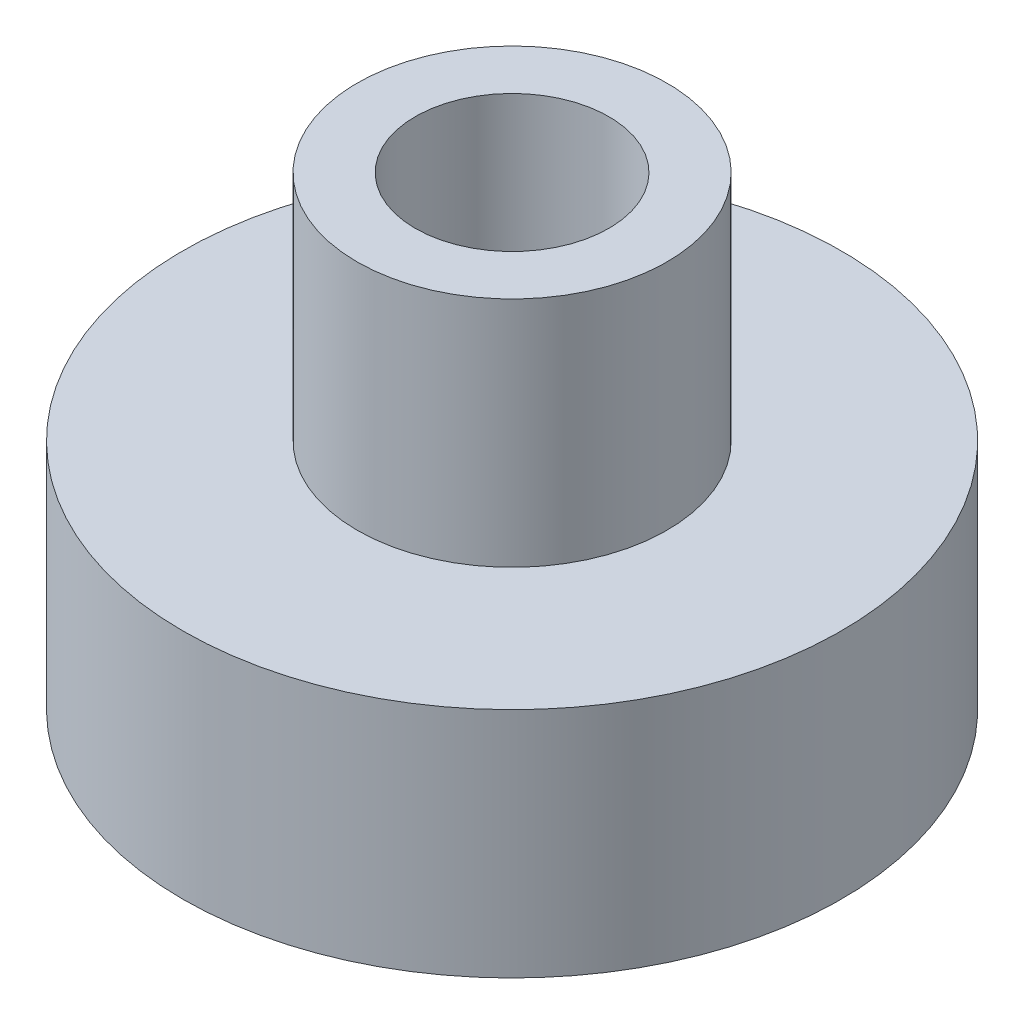
ISO-10303-21;
HEADER;
FILE_DESCRIPTION(('STEP AP214'),'2;1');
FILE_NAME('part.step','',(''),(''),'','','');
FILE_SCHEMA(('AUTOMOTIVE_DESIGN { 1 0 10303 214 1 1 1 1 }'));
ENDSEC;
DATA;
#1=APPLICATION_CONTEXT('core data for automotive mechanical design processes');
#2=APPLICATION_PROTOCOL_DEFINITION('international standard','automotive_design',2000,#1);
#3=PRODUCT_CONTEXT('',#1,'mechanical');
#4=PRODUCT('Part','Part','',(#3));
#5=PRODUCT_RELATED_PRODUCT_CATEGORY('part','',(#4));
#6=PRODUCT_DEFINITION_FORMATION('','',#4);
#7=PRODUCT_DEFINITION_CONTEXT('part definition',#1,'design');
#8=PRODUCT_DEFINITION('design','',#6,#7);
#9=PRODUCT_DEFINITION_SHAPE('','',#8);
#10=(LENGTH_UNIT() NAMED_UNIT(*) SI_UNIT(.MILLI.,.METRE.));
#11=(NAMED_UNIT(*) PLANE_ANGLE_UNIT() SI_UNIT($,.RADIAN.));
#12=(NAMED_UNIT(*) SI_UNIT($,.STERADIAN.) SOLID_ANGLE_UNIT());
#13=UNCERTAINTY_MEASURE_WITH_UNIT(LENGTH_MEASURE(1.E-05),#10,'distance_accuracy_value','');
#14=(GEOMETRIC_REPRESENTATION_CONTEXT(3) GLOBAL_UNCERTAINTY_ASSIGNED_CONTEXT((#13)) GLOBAL_UNIT_ASSIGNED_CONTEXT((#10,
#11,#12)) REPRESENTATION_CONTEXT('',''));
#15=CARTESIAN_POINT('',(0.,0.,0.));
#16=DIRECTION('',(0.,0.,1.));
#17=DIRECTION('',(1.,0.,0.));
#18=AXIS2_PLACEMENT_3D('',#15,#16,#17);
#19=CARTESIAN_POINT('',(0.,6.,0.));
#20=DIRECTION('',(0.,1.,0.));
#21=DIRECTION('',(0.,0.,1.));
#22=AXIS2_PLACEMENT_3D('',#19,#20,#21);
#23=PLANE('',#22);
#24=CARTESIAN_POINT('',(0.,6.,0.));
#25=DIRECTION('',(0.,1.,0.));
#26=DIRECTION('',(0.,0.,1.));
#27=AXIS2_PLACEMENT_3D('',#24,#25,#26);
#28=CIRCLE('',#27,8.5);
#29=CARTESIAN_POINT('',(0.,6.,8.5));
#30=VERTEX_POINT('',#29);
#31=EDGE_CURVE('E10',#30,#30,#28,.T.);
#32=ORIENTED_EDGE('',*,*,#31,.T.);
#33=EDGE_LOOP('',(#32));
#34=FACE_BOUND('',#33,.T.);
#35=CARTESIAN_POINT('',(0.,6.,0.));
#36=DIRECTION('',(0.,1.,0.));
#37=DIRECTION('',(0.,0.,1.));
#38=AXIS2_PLACEMENT_3D('',#35,#36,#37);
#39=CIRCLE('',#38,4.);
#40=CARTESIAN_POINT('',(0.,6.,4.));
#41=VERTEX_POINT('',#40);
#42=EDGE_CURVE('E44',#41,#41,#39,.T.);
#43=ORIENTED_EDGE('',*,*,#42,.F.);
#44=EDGE_LOOP('',(#43));
#45=FACE_BOUND('',#44,.T.);
#46=ADVANCED_FACE('F31',(#34,#45),#23,.T.);
#47=CARTESIAN_POINT('',(0.,6.,0.));
#48=DIRECTION('',(0.,-1.,0.));
#49=DIRECTION('',(0.,0.,-1.));
#50=AXIS2_PLACEMENT_3D('',#47,#48,#49);
#51=CYLINDRICAL_SURFACE('',#50,8.5);
#52=ORIENTED_EDGE('',*,*,#31,.F.);
#53=EDGE_LOOP('',(#52));
#54=FACE_BOUND('',#53,.T.);
#55=CARTESIAN_POINT('',(0.,0.,0.));
#56=DIRECTION('',(0.,1.,0.));
#57=DIRECTION('',(0.,0.,1.));
#58=AXIS2_PLACEMENT_3D('',#55,#56,#57);
#59=CIRCLE('',#58,8.5);
#60=CARTESIAN_POINT('',(0.,0.,8.5));
#61=VERTEX_POINT('',#60);
#62=EDGE_CURVE('E35',#61,#61,#59,.T.);
#63=ORIENTED_EDGE('',*,*,#62,.T.);
#64=EDGE_LOOP('',(#63));
#65=FACE_BOUND('',#64,.T.);
#66=ADVANCED_FACE('F33',(#54,#65),#51,.T.);
#67=CARTESIAN_POINT('',(0.,0.,0.));
#68=DIRECTION('',(0.,1.,0.));
#69=DIRECTION('',(0.,0.,1.));
#70=AXIS2_PLACEMENT_3D('',#67,#68,#69);
#71=PLANE('',#70);
#72=CARTESIAN_POINT('',(0.,0.,0.));
#73=DIRECTION('',(0.,1.,0.));
#74=DIRECTION('',(0.,0.,1.));
#75=AXIS2_PLACEMENT_3D('',#72,#73,#74);
#76=CIRCLE('',#75,2.5);
#77=CARTESIAN_POINT('',(0.,0.,2.5));
#78=VERTEX_POINT('',#77);
#79=EDGE_CURVE('E47',#78,#78,#76,.F.);
#80=ORIENTED_EDGE('',*,*,#79,.F.);
#81=EDGE_LOOP('',(#80));
#82=FACE_BOUND('',#81,.T.);
#83=ORIENTED_EDGE('',*,*,#62,.F.);
#84=EDGE_LOOP('',(#83));
#85=FACE_BOUND('',#84,.T.);
#86=ADVANCED_FACE('F68',(#82,#85),#71,.F.);
#87=CARTESIAN_POINT('',(0.,12.,0.));
#88=DIRECTION('',(0.,-1.,0.));
#89=DIRECTION('',(0.,0.,-1.));
#90=AXIS2_PLACEMENT_3D('',#87,#88,#89);
#91=CYLINDRICAL_SURFACE('',#90,4.);
#92=CARTESIAN_POINT('',(0.,12.,0.));
#93=DIRECTION('',(0.,1.,0.));
#94=DIRECTION('',(0.,0.,1.));
#95=AXIS2_PLACEMENT_3D('',#92,#93,#94);
#96=CIRCLE('',#95,4.);
#97=CARTESIAN_POINT('',(0.,12.,4.));
#98=VERTEX_POINT('',#97);
#99=EDGE_CURVE('E42',#98,#98,#96,.T.);
#100=ORIENTED_EDGE('',*,*,#99,.F.);
#101=EDGE_LOOP('',(#100));
#102=FACE_BOUND('',#101,.T.);
#103=ORIENTED_EDGE('',*,*,#42,.T.);
#104=EDGE_LOOP('',(#103));
#105=FACE_BOUND('',#104,.T.);
#106=ADVANCED_FACE('F62',(#102,#105),#91,.T.);
#107=CARTESIAN_POINT('',(0.,12.,0.));
#108=DIRECTION('',(0.,1.,0.));
#109=DIRECTION('',(0.,0.,1.));
#110=AXIS2_PLACEMENT_3D('',#107,#108,#109);
#111=PLANE('',#110);
#112=CARTESIAN_POINT('',(0.,12.,0.));
#113=DIRECTION('',(0.,1.,0.));
#114=DIRECTION('',(0.,0.,1.));
#115=AXIS2_PLACEMENT_3D('',#112,#113,#114);
#116=CIRCLE('',#115,2.5);
#117=CARTESIAN_POINT('',(0.,12.,2.5));
#118=VERTEX_POINT('',#117);
#119=EDGE_CURVE('E52',#118,#118,#116,.T.);
#120=ORIENTED_EDGE('',*,*,#119,.F.);
#121=EDGE_LOOP('',(#120));
#122=FACE_BOUND('',#121,.T.);
#123=ORIENTED_EDGE('',*,*,#99,.T.);
#124=EDGE_LOOP('',(#123));
#125=FACE_BOUND('',#124,.T.);
#126=ADVANCED_FACE('F59',(#122,#125),#111,.T.);
#127=CARTESIAN_POINT('',(0.,-0.000999999999999265,0.));
#128=DIRECTION('',(0.,1.,0.));
#129=DIRECTION('',(0.,0.,1.));
#130=AXIS2_PLACEMENT_3D('',#127,#128,#129);
#131=CYLINDRICAL_SURFACE('',#130,2.5);
#132=ORIENTED_EDGE('',*,*,#119,.T.);
#133=EDGE_LOOP('',(#132));
#134=FACE_BOUND('',#133,.T.);
#135=ORIENTED_EDGE('',*,*,#79,.T.);
#136=EDGE_LOOP('',(#135));
#137=FACE_BOUND('',#136,.T.);
#138=ADVANCED_FACE('F56',(#134,#137),#131,.F.);
#139=CLOSED_SHELL('',(#46,#66,#86,#106,#126,#138));
#140=MANIFOLD_SOLID_BREP('B2',#139);
#141=ADVANCED_BREP_SHAPE_REPRESENTATION('',(#18,#140),#14);
#142=SHAPE_DEFINITION_REPRESENTATION(#9,#141);
ENDSEC;
END-ISO-10303-21;
